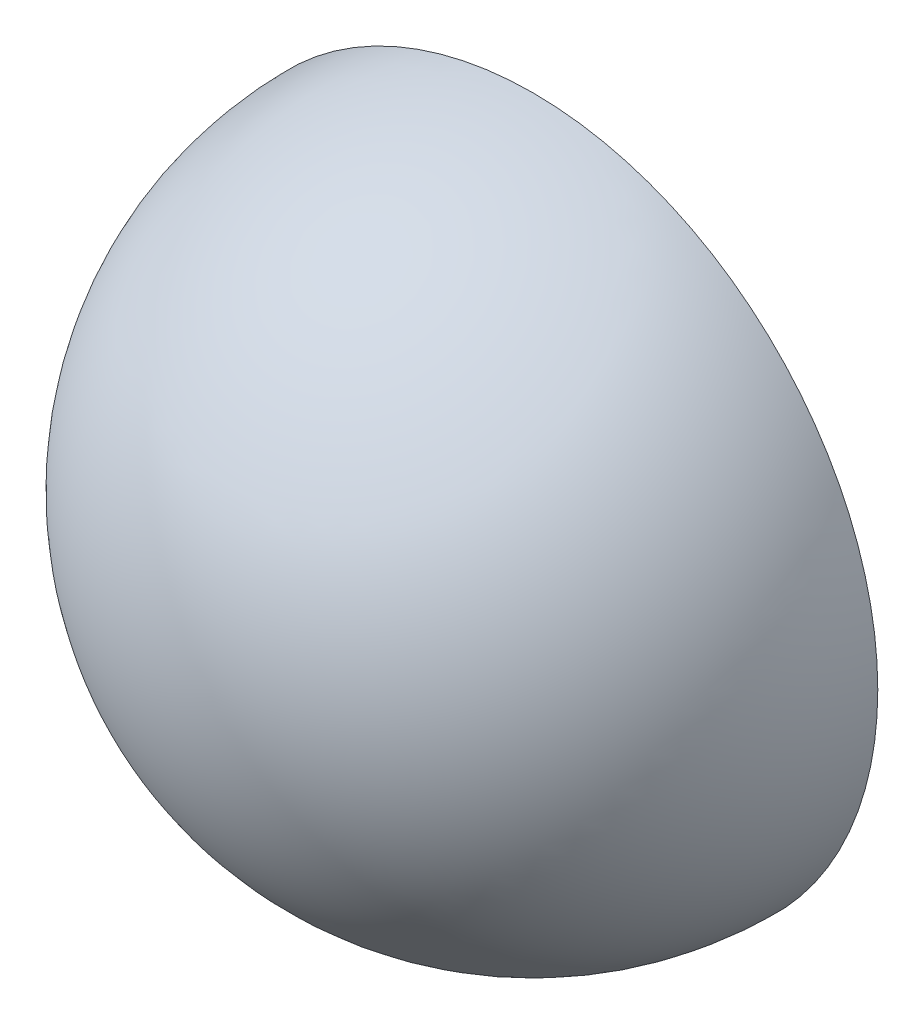
ISO-10303-21;
HEADER;
FILE_DESCRIPTION(('STEP AP214'),'2;1');
FILE_NAME('part.step','',(''),(''),'','','');
FILE_SCHEMA(('AUTOMOTIVE_DESIGN { 1 0 10303 214 1 1 1 1 }'));
ENDSEC;
DATA;
#1=APPLICATION_CONTEXT('core data for automotive mechanical design processes');
#2=APPLICATION_PROTOCOL_DEFINITION('international standard','automotive_design',2000,#1);
#3=PRODUCT_CONTEXT('',#1,'mechanical');
#4=PRODUCT('Part','Part','',(#3));
#5=PRODUCT_RELATED_PRODUCT_CATEGORY('part','',(#4));
#6=PRODUCT_DEFINITION_FORMATION('','',#4);
#7=PRODUCT_DEFINITION_CONTEXT('part definition',#1,'design');
#8=PRODUCT_DEFINITION('design','',#6,#7);
#9=PRODUCT_DEFINITION_SHAPE('','',#8);
#10=(LENGTH_UNIT() NAMED_UNIT(*) SI_UNIT(.MILLI.,.METRE.));
#11=(NAMED_UNIT(*) PLANE_ANGLE_UNIT() SI_UNIT($,.RADIAN.));
#12=(NAMED_UNIT(*) SI_UNIT($,.STERADIAN.) SOLID_ANGLE_UNIT());
#13=UNCERTAINTY_MEASURE_WITH_UNIT(LENGTH_MEASURE(1.E-05),#10,'distance_accuracy_value','');
#14=(GEOMETRIC_REPRESENTATION_CONTEXT(3) GLOBAL_UNCERTAINTY_ASSIGNED_CONTEXT((#13)) GLOBAL_UNIT_ASSIGNED_CONTEXT((#10,
#11,#12)) REPRESENTATION_CONTEXT('',''));
#15=CARTESIAN_POINT('',(0.,0.,0.));
#16=DIRECTION('',(0.,0.,1.));
#17=DIRECTION('',(1.,0.,0.));
#18=AXIS2_PLACEMENT_3D('',#15,#16,#17);
#19=CARTESIAN_POINT('',(0.,0.,0.));
#20=DIRECTION('',(0.,0.,-1.));
#21=DIRECTION('',(-1.,0.,0.));
#22=AXIS2_PLACEMENT_3D('',#19,#20,#21);
#23=PLANE('',#22);
#24=CARTESIAN_POINT('',(0.,0.,0.));
#25=DIRECTION('',(0.,0.,-1.));
#26=DIRECTION('',(-1.,0.,0.));
#27=AXIS2_PLACEMENT_3D('',#24,#25,#26);
#28=CIRCLE('',#27,1.255);
#29=CARTESIAN_POINT('',(-1.255,0.,0.));
#30=VERTEX_POINT('',#29);
#31=EDGE_CURVE('E47',#30,#30,#28,.T.);
#32=ORIENTED_EDGE('',*,*,#31,.F.);
#33=EDGE_LOOP('',(#32));
#34=FACE_BOUND('',#33,.T.);
#35=CARTESIAN_POINT('',(0.,0.,0.));
#36=DIRECTION('',(0.,0.,-1.));
#37=DIRECTION('',(-1.,0.,0.));
#38=AXIS2_PLACEMENT_3D('',#35,#36,#37);
#39=CIRCLE('',#38,2.5);
#40=CARTESIAN_POINT('',(-2.5,0.,0.));
#41=VERTEX_POINT('',#40);
#42=EDGE_CURVE('E10',#41,#41,#39,.T.);
#43=ORIENTED_EDGE('',*,*,#42,.T.);
#44=EDGE_LOOP('',(#43));
#45=FACE_BOUND('',#44,.T.);
#46=ADVANCED_FACE('F37',(#34,#45),#23,.T.);
#47=CARTESIAN_POINT('',(0.,0.,0.));
#48=DIRECTION('',(0.,0.,-1.));
#49=DIRECTION('',(0.,1.,0.));
#50=AXIS2_PLACEMENT_3D('',#47,#48,#49);
#51=SPHERICAL_SURFACE('',#50,2.5);
#52=ORIENTED_EDGE('',*,*,#42,.F.);
#53=EDGE_LOOP('',(#52));
#54=FACE_BOUND('',#53,.T.);
#55=ADVANCED_FACE('F57',(#54),#51,.T.);
#56=CARTESIAN_POINT('',(0.,0.,1.5));
#57=DIRECTION('',(0.,0.,-1.));
#58=DIRECTION('',(-1.,0.,0.));
#59=AXIS2_PLACEMENT_3D('',#56,#57,#58);
#60=CYLINDRICAL_SURFACE('',#59,1.255);
#61=CARTESIAN_POINT('',(0.,0.,1.5));
#62=DIRECTION('',(0.,0.,-1.));
#63=DIRECTION('',(-1.,0.,0.));
#64=AXIS2_PLACEMENT_3D('',#61,#62,#63);
#65=CIRCLE('',#64,1.255);
#66=CARTESIAN_POINT('',(-1.255,0.,1.5));
#67=VERTEX_POINT('',#66);
#68=EDGE_CURVE('E43',#67,#67,#65,.T.);
#69=ORIENTED_EDGE('',*,*,#68,.F.);
#70=EDGE_LOOP('',(#69));
#71=FACE_BOUND('',#70,.T.);
#72=ORIENTED_EDGE('',*,*,#31,.T.);
#73=EDGE_LOOP('',(#72));
#74=FACE_BOUND('',#73,.T.);
#75=ADVANCED_FACE('F54',(#71,#74),#60,.F.);
#76=CARTESIAN_POINT('',(0.,0.,1.5));
#77=DIRECTION('',(0.,0.,-1.));
#78=DIRECTION('',(-1.,0.,0.));
#79=AXIS2_PLACEMENT_3D('',#76,#77,#78);
#80=PLANE('',#79);
#81=ORIENTED_EDGE('',*,*,#68,.T.);
#82=EDGE_LOOP('',(#81));
#83=FACE_BOUND('',#82,.T.);
#84=ADVANCED_FACE('F66',(#83),#80,.T.);
#85=CLOSED_SHELL('',(#46,#55,#75,#84));
#86=MANIFOLD_SOLID_BREP('B2',#85);
#87=ADVANCED_BREP_SHAPE_REPRESENTATION('',(#18,#86),#14);
#88=SHAPE_DEFINITION_REPRESENTATION(#9,#87);
ENDSEC;
END-ISO-10303-21;
